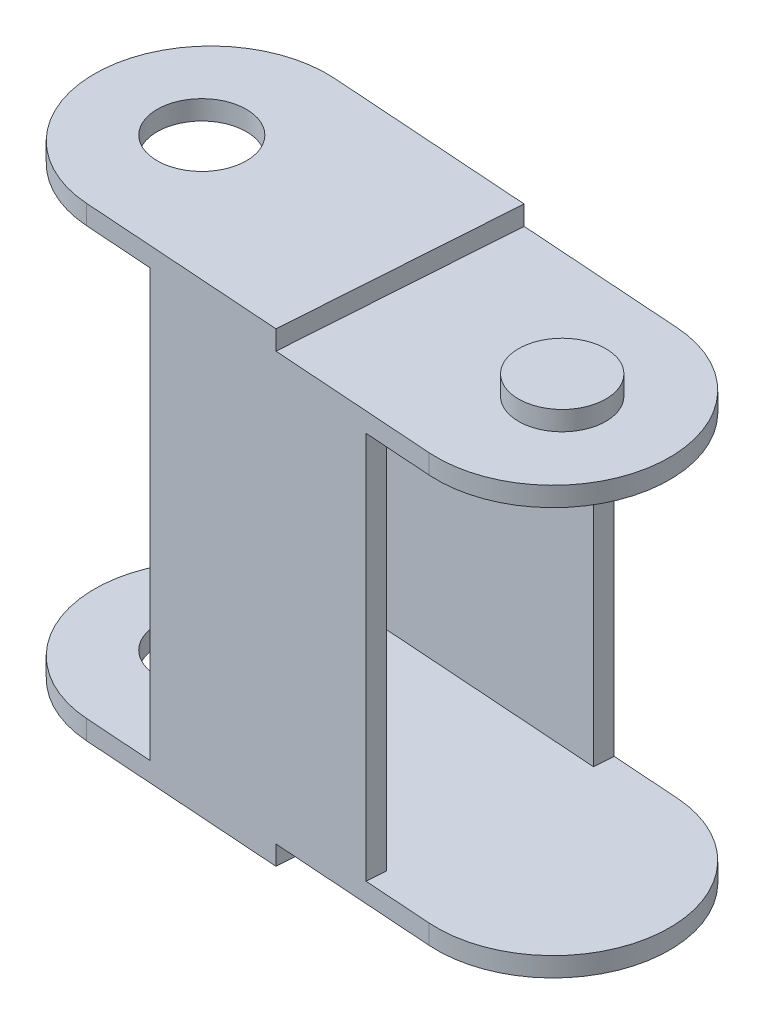
ISO-10303-21;
HEADER;
FILE_DESCRIPTION(('STEP AP214'),'2;1');
FILE_NAME('part.step','',(''),(''),'','','');
FILE_SCHEMA(('AUTOMOTIVE_DESIGN { 1 0 10303 214 1 1 1 1 }'));
ENDSEC;
DATA;
#1=APPLICATION_CONTEXT('core data for automotive mechanical design processes');
#2=APPLICATION_PROTOCOL_DEFINITION('international standard','automotive_design',2000,#1);
#3=PRODUCT_CONTEXT('',#1,'mechanical');
#4=PRODUCT('Part','Part','',(#3));
#5=PRODUCT_RELATED_PRODUCT_CATEGORY('part','',(#4));
#6=PRODUCT_DEFINITION_FORMATION('','',#4);
#7=PRODUCT_DEFINITION_CONTEXT('part definition',#1,'design');
#8=PRODUCT_DEFINITION('design','',#6,#7);
#9=PRODUCT_DEFINITION_SHAPE('','',#8);
#10=(LENGTH_UNIT() NAMED_UNIT(*) SI_UNIT(.MILLI.,.METRE.));
#11=(NAMED_UNIT(*) PLANE_ANGLE_UNIT() SI_UNIT($,.RADIAN.));
#12=(NAMED_UNIT(*) SI_UNIT($,.STERADIAN.) SOLID_ANGLE_UNIT());
#13=UNCERTAINTY_MEASURE_WITH_UNIT(LENGTH_MEASURE(1.E-05),#10,'distance_accuracy_value','');
#14=(GEOMETRIC_REPRESENTATION_CONTEXT(3) GLOBAL_UNCERTAINTY_ASSIGNED_CONTEXT((#13)) GLOBAL_UNIT_ASSIGNED_CONTEXT((#10,
#11,#12)) REPRESENTATION_CONTEXT('',''));
#15=CARTESIAN_POINT('',(0.,0.,0.));
#16=DIRECTION('',(0.,0.,1.));
#17=DIRECTION('',(1.,0.,0.));
#18=AXIS2_PLACEMENT_3D('',#15,#16,#17);
#19=CARTESIAN_POINT('',(-523.000001,21.5,76.));
#20=DIRECTION('',(0.,1.,0.));
#21=DIRECTION('',(0.997646356312232,0.,0.068569291500835));
#22=AXIS2_PLACEMENT_3D('',#19,#20,#21);
#23=CYLINDRICAL_SURFACE('',#22,2.25);
#24=CARTESIAN_POINT('',(-523.000001,21.,76.));
#25=DIRECTION('',(0.,1.,0.));
#26=DIRECTION('',(0.997646356312233,0.,0.068569291500832));
#27=AXIS2_PLACEMENT_3D('',#24,#25,#26);
#28=CIRCLE('',#27,2.25);
#29=CARTESIAN_POINT('',(-520.755296698297,21.,76.1542809058769));
#30=VERTEX_POINT('',#29);
#31=EDGE_CURVE('E205',#30,#30,#28,.F.);
#32=ORIENTED_EDGE('',*,*,#31,.F.);
#33=EDGE_LOOP('',(#32));
#34=FACE_BOUND('',#33,.T.);
#35=CARTESIAN_POINT('',(-523.000001,22.,76.));
#36=DIRECTION('',(0.,-1.,0.));
#37=DIRECTION('',(-0.997646356312233,0.,-0.068569291500832));
#38=AXIS2_PLACEMENT_3D('',#35,#36,#37);
#39=CIRCLE('',#38,2.25);
#40=CARTESIAN_POINT('',(-525.244705301703,22.,75.8457190941231));
#41=VERTEX_POINT('',#40);
#42=EDGE_CURVE('E202',#41,#41,#39,.F.);
#43=ORIENTED_EDGE('',*,*,#42,.F.);
#44=EDGE_LOOP('',(#43));
#45=FACE_BOUND('',#44,.T.);
#46=ADVANCED_FACE('F17',(#34,#45),#23,.T.);
#47=CARTESIAN_POINT('',(-531.567402457783,21.,69.396998238654));
#48=DIRECTION('',(0.,1.,0.));
#49=DIRECTION('',(-0.068569291500836,0.,0.997646356312232));
#50=AXIS2_PLACEMENT_3D('',#47,#48,#49);
#51=PLANE('',#50);
#52=CARTESIAN_POINT('',(-523.498824178263,21.,75.965715354343));
#53=DIRECTION('',(0.,1.,0.));
#54=DIRECTION('',(0.997646356313376,0.,0.0685692914842));
#55=AXIS2_PLACEMENT_3D('',#52,#53,#54);
#56=CIRCLE('',#55,6.);
#57=CARTESIAN_POINT('',(-523.087408429233,21.,69.979837216471));
#58=VERTEX_POINT('',#57);
#59=CARTESIAN_POINT('',(-523.910239927257,21.,81.951593492117));
#60=VERTEX_POINT('',#59);
#61=EDGE_CURVE('E189',#58,#60,#56,.F.);
#62=ORIENTED_EDGE('',*,*,#61,.F.);
#63=DIRECTION('',(-0.997646356311664,0.,-0.068569291509109));
#64=VECTOR('',#63,1.);
#65=CARTESIAN_POINT('',(-523.087408429233,21.,69.979837216474));
#66=LINE('',#65,#64);
#67=CARTESIAN_POINT('',(-531.567402457783,21.,69.396998238654));
#68=VERTEX_POINT('',#67);
#69=EDGE_CURVE('E177',#68,#58,#66,.F.);
#70=ORIENTED_EDGE('',*,*,#69,.F.);
#71=DIRECTION('',(-0.068569291500845,0.,0.997646356312232));
#72=VECTOR('',#71,1.);
#73=CARTESIAN_POINT('',(-531.567402457783,21.,69.396998238654));
#74=LINE('',#73,#72);
#75=CARTESIAN_POINT('',(-532.3902339558,21.,81.3687545145));
#76=VERTEX_POINT('',#75);
#77=EDGE_CURVE('E188',#76,#68,#74,.F.);
#78=ORIENTED_EDGE('',*,*,#77,.F.);
#79=DIRECTION('',(0.997646356313296,0.,0.068569291485357));
#80=VECTOR('',#79,1.);
#81=CARTESIAN_POINT('',(-532.3902339558,21.,81.3687545145));
#82=LINE('',#81,#80);
#83=EDGE_CURVE('E201',#60,#76,#82,.F.);
#84=ORIENTED_EDGE('',*,*,#83,.F.);
#85=EDGE_LOOP('',(#62,#70,#78,#84));
#86=FACE_BOUND('',#85,.T.);
#87=ORIENTED_EDGE('',*,*,#31,.T.);
#88=EDGE_LOOP('',(#87));
#89=FACE_BOUND('',#88,.T.);
#90=ADVANCED_FACE('F199',(#86,#89),#51,.T.);
#91=CARTESIAN_POINT('',(-525.403114108703,22.,78.150482139691));
#92=DIRECTION('',(0.,1.,0.));
#93=DIRECTION('',(0.997646356312232,0.,0.068569291500836));
#94=AXIS2_PLACEMENT_3D('',#91,#92,#93);
#95=PLANE('',#94);
#96=ORIENTED_EDGE('',*,*,#42,.T.);
#97=EDGE_LOOP('',(#96));
#98=FACE_BOUND('',#97,.T.);
#99=ADVANCED_FACE('F629',(#98),#95,.T.);
#100=CARTESIAN_POINT('',(-523.498824178249,-2.,75.965715354143));
#101=DIRECTION('',(0.,1.,0.));
#102=DIRECTION('',(-0.068569291500883,0.,0.997646356312229));
#103=AXIS2_PLACEMENT_3D('',#100,#101,#102);
#104=CYLINDRICAL_SURFACE('',#103,6.);
#105=DIRECTION('',(2.0577E-11,-1.,1.407E-12));
#106=VECTOR('',#105,1.);
#107=CARTESIAN_POINT('',(-523.91023992725,21.,81.951593492017));
#108=LINE('',#107,#106);
#109=CARTESIAN_POINT('',(-523.910239927229,20.,81.951593492018));
#110=VERTEX_POINT('',#109);
#111=EDGE_CURVE('E217',#110,#60,#108,.F.);
#112=ORIENTED_EDGE('',*,*,#111,.F.);
#113=CARTESIAN_POINT('',(-523.498824178249,20.,75.965715354143));
#114=DIRECTION('',(0.,1.,0.));
#115=DIRECTION('',(-0.068569291496696,0.,0.997646356312517));
#116=AXIS2_PLACEMENT_3D('',#113,#114,#115);
#117=CIRCLE('',#116,6.);
#118=CARTESIAN_POINT('',(-523.087408429249,20.,69.97983721647));
#119=VERTEX_POINT('',#118);
#120=EDGE_CURVE('E196',#110,#119,#117,.T.);
#121=ORIENTED_EDGE('',*,*,#120,.T.);
#122=DIRECTION('',(1.5916E-11,1.,1.094E-12));
#123=VECTOR('',#122,1.);
#124=CARTESIAN_POINT('',(-523.087408429249,20.,69.97983721647));
#125=LINE('',#124,#123);
#126=EDGE_CURVE('E181',#119,#58,#125,.T.);
#127=ORIENTED_EDGE('',*,*,#126,.T.);
#128=ORIENTED_EDGE('',*,*,#61,.T.);
#129=EDGE_LOOP('',(#112,#121,#127,#128));
#130=FACE_BOUND('',#129,.T.);
#131=ADVANCED_FACE('F195',(#130),#104,.T.);
#132=CARTESIAN_POINT('',(-523.087408429222,-2.,69.979837216371));
#133=DIRECTION('',(0.068569291500836,0.,-0.997646356312232));
#134=DIRECTION('',(-0.997646356312232,0.,-0.068569291500836));
#135=AXIS2_PLACEMENT_3D('',#132,#133,#134);
#136=PLANE('',#135);
#137=DIRECTION('',(0.,-1.,0.));
#138=VECTOR('',#137,1.);
#139=CARTESIAN_POINT('',(-531.567402457781,22.,69.396998238621));
#140=LINE('',#139,#138);
#141=CARTESIAN_POINT('',(-531.567402457781,22.,69.396998238621));
#142=VERTEX_POINT('',#141);
#143=EDGE_CURVE('E184',#142,#68,#140,.T.);
#144=ORIENTED_EDGE('',*,*,#143,.T.);
#145=ORIENTED_EDGE('',*,*,#69,.T.);
#146=ORIENTED_EDGE('',*,*,#126,.F.);
#147=DIRECTION('',(-0.997646356312232,0.,-0.068569291500836));
#148=VECTOR('',#147,1.);
#149=CARTESIAN_POINT('',(-523.087408429242,20.,69.97983721637));
#150=LINE('',#149,#148);
#151=CARTESIAN_POINT('',(-526.579170676188,20.,69.739844696127));
#152=VERTEX_POINT('',#151);
#153=EDGE_CURVE('E229',#119,#152,#150,.T.);
#154=ORIENTED_EDGE('',*,*,#153,.T.);
#155=DIRECTION('',(0.,-1.,0.));
#156=VECTOR('',#155,1.);
#157=CARTESIAN_POINT('',(-526.579170676188,20.,69.739844696127));
#158=LINE('',#157,#156);
#159=CARTESIAN_POINT('',(-526.579170676188,0.,69.739844696127));
#160=VERTEX_POINT('',#159);
#161=EDGE_CURVE('E233',#152,#160,#158,.T.);
#162=ORIENTED_EDGE('',*,*,#161,.T.);
#163=DIRECTION('',(0.997646356312232,0.,0.068569291500834));
#164=VECTOR('',#163,1.);
#165=CARTESIAN_POINT('',(-526.579170676188,0.,69.739844696127));
#166=LINE('',#165,#164);
#167=CARTESIAN_POINT('',(-523.087408429226,0.,69.979837216371));
#168=VERTEX_POINT('',#167);
#169=EDGE_CURVE('E238',#160,#168,#166,.T.);
#170=ORIENTED_EDGE('',*,*,#169,.T.);
#171=DIRECTION('',(4.32E-12,-1.,2.98E-13));
#172=VECTOR('',#171,1.);
#173=CARTESIAN_POINT('',(-523.087408429226,0.,69.979837216371));
#174=LINE('',#173,#172);
#175=CARTESIAN_POINT('',(-523.087408429222,-1.,69.979837216371));
#176=VERTEX_POINT('',#175);
#177=EDGE_CURVE('E243',#176,#168,#174,.F.);
#178=ORIENTED_EDGE('',*,*,#177,.F.);
#179=DIRECTION('',(-0.997646356312232,0.,-0.068569291500836));
#180=VECTOR('',#179,1.);
#181=CARTESIAN_POINT('',(-523.087408429222,-1.,69.979837216371));
#182=LINE('',#181,#180);
#183=CARTESIAN_POINT('',(-531.567402457781,-1.,69.396998238621));
#184=VERTEX_POINT('',#183);
#185=EDGE_CURVE('E247',#176,#184,#182,.T.);
#186=ORIENTED_EDGE('',*,*,#185,.T.);
#187=DIRECTION('',(0.,-1.,0.));
#188=VECTOR('',#187,1.);
#189=CARTESIAN_POINT('',(-531.567402457781,-1.,69.396998238621));
#190=LINE('',#189,#188);
#191=CARTESIAN_POINT('',(-531.567402457781,-2.,69.396998238621));
#192=VERTEX_POINT('',#191);
#193=EDGE_CURVE('E252',#184,#192,#190,.T.);
#194=ORIENTED_EDGE('',*,*,#193,.T.);
#195=DIRECTION('',(-0.997646356312232,0.,-0.068569291500835));
#196=VECTOR('',#195,1.);
#197=CARTESIAN_POINT('',(-531.567402457781,-2.,69.396998238621));
#198=LINE('',#197,#196);
#199=CARTESIAN_POINT('',(-542.042689199083,-2.,68.67702067786));
#200=VERTEX_POINT('',#199);
#201=EDGE_CURVE('E257',#192,#200,#198,.T.);
#202=ORIENTED_EDGE('',*,*,#201,.T.);
#203=DIRECTION('',(0.,1.,0.));
#204=VECTOR('',#203,1.);
#205=CARTESIAN_POINT('',(-542.042689199083,-2.,68.67702067786));
#206=LINE('',#205,#204);
#207=CARTESIAN_POINT('',(-542.042689199083,-1.,68.67702067786));
#208=VERTEX_POINT('',#207);
#209=EDGE_CURVE('E262',#200,#208,#206,.T.);
#210=ORIENTED_EDGE('',*,*,#209,.T.);
#211=DIRECTION('',(0.997646356312232,0.,0.068569291500835));
#212=VECTOR('',#211,1.);
#213=CARTESIAN_POINT('',(-542.042689199083,-1.,68.67702067786));
#214=LINE('',#213,#212);
#215=CARTESIAN_POINT('',(-538.550926951972,-1.,68.917013198115));
#216=VERTEX_POINT('',#215);
#217=EDGE_CURVE('E267',#208,#216,#214,.T.);
#218=ORIENTED_EDGE('',*,*,#217,.T.);
#219=DIRECTION('',(0.,1.,0.));
#220=VECTOR('',#219,1.);
#221=CARTESIAN_POINT('',(-538.550926951972,-1.,68.917013198115));
#222=LINE('',#221,#220);
#223=CARTESIAN_POINT('',(-538.550926951972,21.,68.917013198115));
#224=VERTEX_POINT('',#223);
#225=EDGE_CURVE('E272',#216,#224,#222,.T.);
#226=ORIENTED_EDGE('',*,*,#225,.T.);
#227=DIRECTION('',(-0.997646356312232,0.,-0.068569291500833));
#228=VECTOR('',#227,1.);
#229=CARTESIAN_POINT('',(-538.550926951972,21.,68.917013198115));
#230=LINE('',#229,#228);
#231=CARTESIAN_POINT('',(-542.042689199083,21.,68.67702067786));
#232=VERTEX_POINT('',#231);
#233=EDGE_CURVE('E277',#224,#232,#230,.T.);
#234=ORIENTED_EDGE('',*,*,#233,.T.);
#235=DIRECTION('',(0.,1.,0.));
#236=VECTOR('',#235,1.);
#237=CARTESIAN_POINT('',(-542.042689199083,21.,68.67702067786));
#238=LINE('',#237,#236);
#239=CARTESIAN_POINT('',(-542.042689199083,22.,68.67702067786));
#240=VERTEX_POINT('',#239);
#241=EDGE_CURVE('E282',#232,#240,#238,.T.);
#242=ORIENTED_EDGE('',*,*,#241,.T.);
#243=DIRECTION('',(0.997646356312232,0.,0.068569291500835));
#244=VECTOR('',#243,1.);
#245=CARTESIAN_POINT('',(-542.042689199083,22.,68.67702067786));
#246=LINE('',#245,#244);
#247=EDGE_CURVE('E287',#240,#142,#246,.T.);
#248=ORIENTED_EDGE('',*,*,#247,.T.);
#249=EDGE_LOOP('',(#144,#145,#146,#154,#162,#170,#178,#186,#194,#202,#210,#218,#226,#234,#242,#248));
#250=FACE_BOUND('',#249,.T.);
#251=ADVANCED_FACE('F179',(#250),#136,.T.);
#252=CARTESIAN_POINT('',(-532.3902339558,21.,81.3687545145));
#253=DIRECTION('',(0.997646356312232,0.,0.068569291500836));
#254=DIRECTION('',(0.068569291500836,0.,-0.997646356312232));
#255=AXIS2_PLACEMENT_3D('',#252,#253,#254);
#256=PLANE('',#255);
#257=DIRECTION('',(-0.068569291500834,0.,0.997646356312232));
#258=VECTOR('',#257,1.);
#259=CARTESIAN_POINT('',(-531.567402457785,22.,69.396998238674));
#260=LINE('',#259,#258);
#261=CARTESIAN_POINT('',(-532.390233955798,22.,81.368754514474));
#262=VERTEX_POINT('',#261);
#263=EDGE_CURVE('E291',#262,#142,#260,.F.);
#264=ORIENTED_EDGE('',*,*,#263,.F.);
#265=DIRECTION('',(-1.819E-12,-1.,2.5736E-11));
#266=VECTOR('',#265,1.);
#267=CARTESIAN_POINT('',(-532.390233955798,22.,81.368754514474));
#268=LINE('',#267,#266);
#269=EDGE_CURVE('E295',#76,#262,#268,.F.);
#270=ORIENTED_EDGE('',*,*,#269,.F.);
#271=ORIENTED_EDGE('',*,*,#77,.T.);
#272=ORIENTED_EDGE('',*,*,#143,.F.);
#273=EDGE_LOOP('',(#264,#270,#271,#272));
#274=FACE_BOUND('',#273,.T.);
#275=ADVANCED_FACE('F613',(#274),#256,.T.);
#276=CARTESIAN_POINT('',(-542.865520697094,-2.,80.648776953607));
#277=DIRECTION('',(-0.068569291500836,0.,0.997646356312232));
#278=DIRECTION('',(0.997646356312232,0.,0.068569291500836));
#279=AXIS2_PLACEMENT_3D('',#276,#277,#278);
#280=PLANE('',#279);
#281=ORIENTED_EDGE('',*,*,#83,.T.);
#282=ORIENTED_EDGE('',*,*,#269,.T.);
#283=DIRECTION('',(-0.997646356312232,0.,-0.068569291500835));
#284=VECTOR('',#283,1.);
#285=CARTESIAN_POINT('',(-532.390233955791,22.,81.368754514368));
#286=LINE('',#285,#284);
#287=CARTESIAN_POINT('',(-542.865520697094,22.,80.648776953607));
#288=VERTEX_POINT('',#287);
#289=EDGE_CURVE('E300',#262,#288,#286,.T.);
#290=ORIENTED_EDGE('',*,*,#289,.T.);
#291=DIRECTION('',(-1.14E-13,-1.,0.));
#292=VECTOR('',#291,1.);
#293=CARTESIAN_POINT('',(-542.865520697094,22.,80.648776953607));
#294=LINE('',#293,#292);
#295=CARTESIAN_POINT('',(-542.865520697094,21.,80.648776953607));
#296=VERTEX_POINT('',#295);
#297=EDGE_CURVE('E305',#296,#288,#294,.F.);
#298=ORIENTED_EDGE('',*,*,#297,.F.);
#299=DIRECTION('',(0.997646356312232,0.,0.068569291500838));
#300=VECTOR('',#299,1.);
#301=CARTESIAN_POINT('',(-542.865520697094,21.,80.648776953607));
#302=LINE('',#301,#300);
#303=CARTESIAN_POINT('',(-539.373758449982,21.,80.888769473861));
#304=VERTEX_POINT('',#303);
#305=EDGE_CURVE('E310',#296,#304,#302,.T.);
#306=ORIENTED_EDGE('',*,*,#305,.T.);
#307=DIRECTION('',(0.,-1.,0.));
#308=VECTOR('',#307,1.);
#309=CARTESIAN_POINT('',(-539.373758449982,21.,80.888769473861));
#310=LINE('',#309,#308);
#311=CARTESIAN_POINT('',(-539.373758449982,-1.,80.888769473861));
#312=VERTEX_POINT('',#311);
#313=EDGE_CURVE('E315',#304,#312,#310,.T.);
#314=ORIENTED_EDGE('',*,*,#313,.T.);
#315=DIRECTION('',(-0.997646356312232,0.,-0.068569291500834));
#316=VECTOR('',#315,1.);
#317=CARTESIAN_POINT('',(-539.373758449982,-1.,80.888769473861));
#318=LINE('',#317,#316);
#319=CARTESIAN_POINT('',(-542.865520697094,-1.,80.648776953607));
#320=VERTEX_POINT('',#319);
#321=EDGE_CURVE('E320',#312,#320,#318,.T.);
#322=ORIENTED_EDGE('',*,*,#321,.T.);
#323=DIRECTION('',(0.,-1.,0.));
#324=VECTOR('',#323,1.);
#325=CARTESIAN_POINT('',(-542.865520697094,-1.,80.648776953607));
#326=LINE('',#325,#324);
#327=CARTESIAN_POINT('',(-542.865520697094,-2.,80.648776953607));
#328=VERTEX_POINT('',#327);
#329=EDGE_CURVE('E325',#328,#320,#326,.F.);
#330=ORIENTED_EDGE('',*,*,#329,.F.);
#331=DIRECTION('',(0.997646356312232,0.,0.068569291500836));
#332=VECTOR('',#331,1.);
#333=CARTESIAN_POINT('',(-542.865520697094,-2.,80.648776953607));
#334=LINE('',#333,#332);
#335=CARTESIAN_POINT('',(-532.390233955791,-2.,81.368754514367));
#336=VERTEX_POINT('',#335);
#337=EDGE_CURVE('E330',#328,#336,#334,.T.);
#338=ORIENTED_EDGE('',*,*,#337,.T.);
#339=DIRECTION('',(1.14E-13,1.,0.));
#340=VECTOR('',#339,1.);
#341=CARTESIAN_POINT('',(-532.390233955791,-2.,81.368754514367));
#342=LINE('',#341,#340);
#343=CARTESIAN_POINT('',(-532.390233955791,-1.,81.368754514367));
#344=VERTEX_POINT('',#343);
#345=EDGE_CURVE('E335',#336,#344,#342,.T.);
#346=ORIENTED_EDGE('',*,*,#345,.T.);
#347=DIRECTION('',(0.997646356312232,0.,0.068569291500837));
#348=VECTOR('',#347,1.);
#349=CARTESIAN_POINT('',(-532.390233955791,-1.,81.368754514367));
#350=LINE('',#349,#348);
#351=CARTESIAN_POINT('',(-523.910239927257,-1.,81.951593492116));
#352=VERTEX_POINT('',#351);
#353=EDGE_CURVE('E340',#344,#352,#350,.T.);
#354=ORIENTED_EDGE('',*,*,#353,.T.);
#355=DIRECTION('',(4.661E-12,1.,3.13E-13));
#356=VECTOR('',#355,1.);
#357=CARTESIAN_POINT('',(-523.910239927257,-1.,81.951593492116));
#358=LINE('',#357,#356);
#359=CARTESIAN_POINT('',(-523.910239927252,0.,81.951593492117));
#360=VERTEX_POINT('',#359);
#361=EDGE_CURVE('E345',#352,#360,#358,.T.);
#362=ORIENTED_EDGE('',*,*,#361,.T.);
#363=DIRECTION('',(-0.997646356312232,0.,-0.068569291500836));
#364=VECTOR('',#363,1.);
#365=CARTESIAN_POINT('',(-523.910239927252,0.,81.951593492117));
#366=LINE('',#365,#364);
#367=CARTESIAN_POINT('',(-527.402002174198,0.,81.711600971874));
#368=VERTEX_POINT('',#367);
#369=EDGE_CURVE('E350',#360,#368,#366,.T.);
#370=ORIENTED_EDGE('',*,*,#369,.T.);
#371=DIRECTION('',(0.,1.,0.));
#372=VECTOR('',#371,1.);
#373=CARTESIAN_POINT('',(-527.402002174198,0.,81.711600971874));
#374=LINE('',#373,#372);
#375=CARTESIAN_POINT('',(-527.402002174198,20.,81.711600971874));
#376=VERTEX_POINT('',#375);
#377=EDGE_CURVE('E355',#368,#376,#374,.T.);
#378=ORIENTED_EDGE('',*,*,#377,.T.);
#379=DIRECTION('',(0.997646356312232,0.,0.068569291500834));
#380=VECTOR('',#379,1.);
#381=CARTESIAN_POINT('',(-527.402002174198,20.,81.711600971874));
#382=LINE('',#381,#380);
#383=EDGE_CURVE('E360',#376,#110,#382,.T.);
#384=ORIENTED_EDGE('',*,*,#383,.T.);
#385=ORIENTED_EDGE('',*,*,#111,.T.);
#386=EDGE_LOOP('',(#281,#282,#290,#298,#306,#314,#322,#330,#338,#346,#354,#362,#370,#378,#384,#385));
#387=FACE_BOUND('',#386,.T.);
#388=ADVANCED_FACE('F555',(#387),#280,.T.);
#389=CARTESIAN_POINT('',(-539.373758449983,20.,80.888769473868));
#390=DIRECTION('',(0.,-1.,0.));
#391=DIRECTION('',(0.068569291500836,0.,-0.997646356312232));
#392=AXIS2_PLACEMENT_3D('',#389,#390,#391);
#393=PLANE('',#392);
#394=CARTESIAN_POINT('',(-542.952928126245,20.,74.628614169983));
#395=DIRECTION('',(0.,1.,0.));
#396=DIRECTION('',(0.997646356312232,0.,0.068569291500841));
#397=AXIS2_PLACEMENT_3D('',#394,#395,#396);
#398=CIRCLE('',#397,6.2);
#399=CARTESIAN_POINT('',(-539.287161449229,20.,79.628829632309));
#400=VERTEX_POINT('',#399);
#401=CARTESIAN_POINT('',(-538.637523952725,20.,70.176953039667));
#402=VERTEX_POINT('',#401);
#403=EDGE_CURVE('E365',#400,#402,#398,.T.);
#404=ORIENTED_EDGE('',*,*,#403,.T.);
#405=DIRECTION('',(0.068569291501466,0.,-0.997646356312189));
#406=VECTOR('',#405,1.);
#407=CARTESIAN_POINT('',(-538.637523952725,20.,70.176953039667));
#408=LINE('',#407,#406);
#409=CARTESIAN_POINT('',(-538.619496243473,20.,69.914659554427));
#410=VERTEX_POINT('',#409);
#411=EDGE_CURVE('E370',#402,#410,#408,.T.);
#412=ORIENTED_EDGE('',*,*,#411,.T.);
#413=DIRECTION('',(0.997646356312233,0.,0.068569291500831));
#414=VECTOR('',#413,1.);
#415=CARTESIAN_POINT('',(-538.619496243473,20.,69.914659554427));
#416=LINE('',#415,#414);
#417=CARTESIAN_POINT('',(-526.647739967689,20.,70.737491052439));
#418=VERTEX_POINT('',#417);
#419=EDGE_CURVE('E375',#418,#410,#416,.F.);
#420=ORIENTED_EDGE('',*,*,#419,.F.);
#421=DIRECTION('',(0.06856929150068,0.,-0.997646356312243));
#422=VECTOR('',#421,1.);
#423=CARTESIAN_POINT('',(-526.647739967689,20.,70.737491052439));
#424=LINE('',#423,#422);
#425=EDGE_CURVE('E379',#152,#418,#424,.F.);
#426=ORIENTED_EDGE('',*,*,#425,.F.);
#427=ORIENTED_EDGE('',*,*,#153,.F.);
#428=ORIENTED_EDGE('',*,*,#120,.F.);
#429=ORIENTED_EDGE('',*,*,#383,.F.);
#430=DIRECTION('',(0.068569291500585,0.,-0.997646356312249));
#431=VECTOR('',#430,1.);
#432=CARTESIAN_POINT('',(-527.402002174199,20.,81.71160097188));
#433=LINE('',#432,#431);
#434=CARTESIAN_POINT('',(-527.333432882698,20.,80.713954615562));
#435=VERTEX_POINT('',#434);
#436=EDGE_CURVE('E384',#435,#376,#433,.F.);
#437=ORIENTED_EDGE('',*,*,#436,.F.);
#438=DIRECTION('',(-0.997646356312232,0.,-0.068569291500835));
#439=VECTOR('',#438,1.);
#440=CARTESIAN_POINT('',(-527.333432882698,20.,80.713954615562));
#441=LINE('',#440,#439);
#442=CARTESIAN_POINT('',(-539.305189158481,20.,79.891123117549));
#443=VERTEX_POINT('',#442);
#444=EDGE_CURVE('E388',#443,#435,#441,.F.);
#445=ORIENTED_EDGE('',*,*,#444,.F.);
#446=DIRECTION('',(0.068569291500197,0.,-0.997646356312276));
#447=VECTOR('',#446,1.);
#448=CARTESIAN_POINT('',(-539.305189158481,20.,79.891123117549));
#449=LINE('',#448,#447);
#450=EDGE_CURVE('E392',#443,#400,#449,.T.);
#451=ORIENTED_EDGE('',*,*,#450,.T.);
#452=EDGE_LOOP('',(#404,#412,#420,#426,#427,#428,#429,#437,#445,#451));
#453=FACE_BOUND('',#452,.T.);
#454=ADVANCED_FACE('F557',(#453),#393,.T.);
#455=CARTESIAN_POINT('',(-526.647739967689,20.,70.737491052439));
#456=DIRECTION('',(0.997646356312232,0.,0.068569291500836));
#457=DIRECTION('',(0.,-1.,0.));
#458=AXIS2_PLACEMENT_3D('',#455,#456,#457);
#459=PLANE('',#458);
#460=DIRECTION('',(0.,-1.,0.));
#461=VECTOR('',#460,1.);
#462=CARTESIAN_POINT('',(-526.647739967689,20.,70.737491052439));
#463=LINE('',#462,#461);
#464=CARTESIAN_POINT('',(-526.647739967689,0.,70.737491052439));
#465=VERTEX_POINT('',#464);
#466=EDGE_CURVE('E397',#465,#418,#463,.F.);
#467=ORIENTED_EDGE('',*,*,#466,.F.);
#468=DIRECTION('',(0.068569291500809,0.,-0.997646356312234));
#469=VECTOR('',#468,1.);
#470=CARTESIAN_POINT('',(-526.647739967689,0.,70.737491052439));
#471=LINE('',#470,#469);
#472=EDGE_CURVE('E401',#465,#160,#471,.T.);
#473=ORIENTED_EDGE('',*,*,#472,.T.);
#474=ORIENTED_EDGE('',*,*,#161,.F.);
#475=ORIENTED_EDGE('',*,*,#425,.T.);
#476=EDGE_LOOP('',(#467,#473,#474,#475));
#477=FACE_BOUND('',#476,.T.);
#478=ADVANCED_FACE('F563',(#477),#459,.T.);
#479=CARTESIAN_POINT('',(-539.373758449984,0.,80.888769473881));
#480=DIRECTION('',(0.,1.,0.));
#481=DIRECTION('',(0.997646356312232,0.,0.068569291500836));
#482=AXIS2_PLACEMENT_3D('',#479,#480,#481);
#483=PLANE('',#482);
#484=CARTESIAN_POINT('',(-542.952928126245,0.,74.628614169983));
#485=DIRECTION('',(0.,-1.,0.));
#486=DIRECTION('',(0.997646356312232,0.,0.06856929150084));
#487=AXIS2_PLACEMENT_3D('',#484,#485,#486);
#488=CIRCLE('',#487,6.2);
#489=CARTESIAN_POINT('',(-538.637523952725,0.,70.176953039667));
#490=VERTEX_POINT('',#489);
#491=CARTESIAN_POINT('',(-539.287161449229,0.,79.628829632309));
#492=VERTEX_POINT('',#491);
#493=EDGE_CURVE('E406',#490,#492,#488,.T.);
#494=ORIENTED_EDGE('',*,*,#493,.T.);
#495=DIRECTION('',(-0.068569291501918,0.,0.997646356312158));
#496=VECTOR('',#495,1.);
#497=CARTESIAN_POINT('',(-539.287161449229,0.,79.628829632309));
#498=LINE('',#497,#496);
#499=CARTESIAN_POINT('',(-539.305189158482,0.,79.891123117549));
#500=VERTEX_POINT('',#499);
#501=EDGE_CURVE('E411',#492,#500,#498,.T.);
#502=ORIENTED_EDGE('',*,*,#501,.T.);
#503=DIRECTION('',(0.997646356312232,0.,0.068569291500834));
#504=VECTOR('',#503,1.);
#505=CARTESIAN_POINT('',(-539.305189158482,0.,79.891123117549));
#506=LINE('',#505,#504);
#507=CARTESIAN_POINT('',(-527.333432882697,0.,80.713954615562));
#508=VERTEX_POINT('',#507);
#509=EDGE_CURVE('E416',#508,#500,#506,.F.);
#510=ORIENTED_EDGE('',*,*,#509,.F.);
#511=DIRECTION('',(-0.068569291501164,0.,0.99764635631221));
#512=VECTOR('',#511,1.);
#513=CARTESIAN_POINT('',(-527.333432882697,0.,80.713954615562));
#514=LINE('',#513,#512);
#515=EDGE_CURVE('E420',#368,#508,#514,.F.);
#516=ORIENTED_EDGE('',*,*,#515,.F.);
#517=ORIENTED_EDGE('',*,*,#369,.F.);
#518=CARTESIAN_POINT('',(-523.498824178263,0.,75.965715354343));
#519=DIRECTION('',(0.,1.,0.));
#520=DIRECTION('',(0.997646356313376,0.,0.068569291484202));
#521=AXIS2_PLACEMENT_3D('',#518,#519,#520);
#522=CIRCLE('',#521,6.);
#523=EDGE_CURVE('E425',#168,#360,#522,.F.);
#524=ORIENTED_EDGE('',*,*,#523,.F.);
#525=ORIENTED_EDGE('',*,*,#169,.F.);
#526=ORIENTED_EDGE('',*,*,#472,.F.);
#527=DIRECTION('',(-0.997646356312233,0.,-0.06856929150083));
#528=VECTOR('',#527,1.);
#529=CARTESIAN_POINT('',(-526.647739967689,0.,70.737491052439));
#530=LINE('',#529,#528);
#531=CARTESIAN_POINT('',(-538.619496243473,0.,69.914659554427));
#532=VERTEX_POINT('',#531);
#533=EDGE_CURVE('E429',#532,#465,#530,.F.);
#534=ORIENTED_EDGE('',*,*,#533,.F.);
#535=DIRECTION('',(-0.068569291499722,0.,0.997646356312309));
#536=VECTOR('',#535,1.);
#537=CARTESIAN_POINT('',(-538.619496243473,0.,69.914659554427));
#538=LINE('',#537,#536);
#539=EDGE_CURVE('E433',#532,#490,#538,.T.);
#540=ORIENTED_EDGE('',*,*,#539,.T.);
#541=EDGE_LOOP('',(#494,#502,#510,#516,#517,#524,#525,#526,#534,#540));
#542=FACE_BOUND('',#541,.T.);
#543=ADVANCED_FACE('F549',(#542),#483,.T.);
#544=CARTESIAN_POINT('',(-523.498824178263,-2.,75.965715354343));
#545=DIRECTION('',(0.,1.,0.));
#546=DIRECTION('',(0.997646356313376,0.,0.068569291484202));
#547=AXIS2_PLACEMENT_3D('',#544,#545,#546);
#548=CYLINDRICAL_SURFACE('',#547,6.);
#549=ORIENTED_EDGE('',*,*,#177,.T.);
#550=ORIENTED_EDGE('',*,*,#523,.T.);
#551=ORIENTED_EDGE('',*,*,#361,.F.);
#552=CARTESIAN_POINT('',(-523.498824178249,-1.,75.965715354143));
#553=DIRECTION('',(0.,-1.,0.));
#554=DIRECTION('',(0.99764635631109,0.,0.068569291517456));
#555=AXIS2_PLACEMENT_3D('',#552,#553,#554);
#556=CIRCLE('',#555,6.);
#557=EDGE_CURVE('E438',#352,#176,#556,.F.);
#558=ORIENTED_EDGE('',*,*,#557,.T.);
#559=EDGE_LOOP('',(#549,#550,#551,#558));
#560=FACE_BOUND('',#559,.T.);
#561=ADVANCED_FACE('F570',(#560),#548,.T.);
#562=CARTESIAN_POINT('',(-532.390233955793,-1.,81.368754514401));
#563=DIRECTION('',(0.,-1.,0.));
#564=DIRECTION('',(0.068569291500836,0.,-0.997646356312232));
#565=AXIS2_PLACEMENT_3D('',#562,#563,#564);
#566=PLANE('',#565);
#567=ORIENTED_EDGE('',*,*,#557,.F.);
#568=ORIENTED_EDGE('',*,*,#353,.F.);
#569=DIRECTION('',(0.068569291500836,0.,-0.997646356312232));
#570=VECTOR('',#569,1.);
#571=CARTESIAN_POINT('',(-532.390233955793,-1.,81.368754514401));
#572=LINE('',#571,#570);
#573=EDGE_CURVE('E443',#344,#184,#572,.T.);
#574=ORIENTED_EDGE('',*,*,#573,.T.);
#575=ORIENTED_EDGE('',*,*,#185,.F.);
#576=EDGE_LOOP('',(#567,#568,#574,#575));
#577=FACE_BOUND('',#576,.T.);
#578=CARTESIAN_POINT('',(-523.000001,-1.,76.));
#579=DIRECTION('',(0.,1.,0.));
#580=DIRECTION('',(0.997646356312233,0.,0.068569291500829));
#581=AXIS2_PLACEMENT_3D('',#578,#579,#580);
#582=CIRCLE('',#581,2.25);
#583=CARTESIAN_POINT('',(-520.755296698297,-1.,76.1542809058769));
#584=VERTEX_POINT('',#583);
#585=EDGE_CURVE('E448',#584,#584,#582,.T.);
#586=ORIENTED_EDGE('',*,*,#585,.T.);
#587=EDGE_LOOP('',(#586));
#588=FACE_BOUND('',#587,.T.);
#589=ADVANCED_FACE('F574',(#577,#588),#566,.T.);
#590=CARTESIAN_POINT('',(-532.390233955793,-2.,81.368754514401));
#591=DIRECTION('',(0.997646356312232,0.,0.068569291500836));
#592=DIRECTION('',(0.068569291500836,0.,-0.997646356312232));
#593=AXIS2_PLACEMENT_3D('',#590,#591,#592);
#594=PLANE('',#593);
#595=ORIENTED_EDGE('',*,*,#573,.F.);
#596=ORIENTED_EDGE('',*,*,#345,.F.);
#597=DIRECTION('',(0.068569291500834,0.,-0.997646356312232));
#598=VECTOR('',#597,1.);
#599=CARTESIAN_POINT('',(-532.390233955792,-2.,81.368754514388));
#600=LINE('',#599,#598);
#601=EDGE_CURVE('E453',#192,#336,#600,.F.);
#602=ORIENTED_EDGE('',*,*,#601,.F.);
#603=ORIENTED_EDGE('',*,*,#193,.F.);
#604=EDGE_LOOP('',(#595,#596,#602,#603));
#605=FACE_BOUND('',#604,.T.);
#606=ADVANCED_FACE('F578',(#605),#594,.T.);
#607=CARTESIAN_POINT('',(-548.851398834877,-2.,80.237361204741));
#608=DIRECTION('',(0.,-1.,0.));
#609=DIRECTION('',(0.068569291500836,0.,-0.997646356312232));
#610=AXIS2_PLACEMENT_3D('',#607,#608,#609);
#611=PLANE('',#610);
#612=ORIENTED_EDGE('',*,*,#601,.T.);
#613=ORIENTED_EDGE('',*,*,#337,.F.);
#614=CARTESIAN_POINT('',(-542.454104947996,-2.,74.66289881584));
#615=DIRECTION('',(0.,-1.,0.));
#616=DIRECTION('',(-0.997646356311089,0.,-0.068569291517474));
#617=AXIS2_PLACEMENT_3D('',#614,#615,#616);
#618=CIRCLE('',#617,6.);
#619=EDGE_CURVE('E455',#200,#328,#618,.F.);
#620=ORIENTED_EDGE('',*,*,#619,.F.);
#621=ORIENTED_EDGE('',*,*,#201,.F.);
#622=EDGE_LOOP('',(#612,#613,#620,#621));
#623=FACE_BOUND('',#622,.T.);
#624=CARTESIAN_POINT('',(-542.9529281263,-2.,74.6286141702));
#625=DIRECTION('',(0.,1.,0.));
#626=DIRECTION('',(0.997646356312232,0.,0.068569291500838));
#627=AXIS2_PLACEMENT_3D('',#624,#625,#626);
#628=CIRCLE('',#627,2.3);
#629=CARTESIAN_POINT('',(-540.658341506782,-2.,74.7863235406519));
#630=VERTEX_POINT('',#629);
#631=EDGE_CURVE('E459',#630,#630,#628,.T.);
#632=ORIENTED_EDGE('',*,*,#631,.T.);
#633=EDGE_LOOP('',(#632));
#634=FACE_BOUND('',#633,.T.);
#635=ADVANCED_FACE('F581',(#623,#634),#611,.T.);
#636=CARTESIAN_POINT('',(-542.454104947996,-2.,74.66289881584));
#637=DIRECTION('',(0.,1.,0.));
#638=DIRECTION('',(0.06856929148436,0.,-0.997646356313365));
#639=AXIS2_PLACEMENT_3D('',#636,#637,#638);
#640=CYLINDRICAL_SURFACE('',#639,6.);
#641=ORIENTED_EDGE('',*,*,#209,.F.);
#642=ORIENTED_EDGE('',*,*,#619,.T.);
#643=ORIENTED_EDGE('',*,*,#329,.T.);
#644=CARTESIAN_POINT('',(-542.454104947982,-1.,74.662898815641));
#645=DIRECTION('',(0.,1.,0.));
#646=DIRECTION('',(-0.997646356313374,0.,-0.06856929148422));
#647=AXIS2_PLACEMENT_3D('',#644,#645,#646);
#648=CIRCLE('',#647,6.);
#649=EDGE_CURVE('E464',#320,#208,#648,.F.);
#650=ORIENTED_EDGE('',*,*,#649,.T.);
#651=EDGE_LOOP('',(#641,#642,#643,#650));
#652=FACE_BOUND('',#651,.T.);
#653=ADVANCED_FACE('F587',(#652),#640,.T.);
#654=CARTESIAN_POINT('',(-548.851398834877,-1.,80.23736120475));
#655=DIRECTION('',(0.,1.,0.));
#656=DIRECTION('',(0.997646356312232,0.,0.068569291500836));
#657=AXIS2_PLACEMENT_3D('',#654,#655,#656);
#658=PLANE('',#657);
#659=ORIENTED_EDGE('',*,*,#217,.F.);
#660=ORIENTED_EDGE('',*,*,#649,.F.);
#661=ORIENTED_EDGE('',*,*,#321,.F.);
#662=DIRECTION('',(0.06856929150083,0.,-0.997646356312233));
#663=VECTOR('',#662,1.);
#664=CARTESIAN_POINT('',(-539.373758449992,-1.,80.888769474002));
#665=LINE('',#664,#663);
#666=CARTESIAN_POINT('',(-539.287161449229,-1.,79.628829632309));
#667=VERTEX_POINT('',#666);
#668=EDGE_CURVE('E467',#667,#312,#665,.F.);
#669=ORIENTED_EDGE('',*,*,#668,.F.);
#670=CARTESIAN_POINT('',(-542.952928126245,-1.,74.628614169983));
#671=DIRECTION('',(0.,1.,0.));
#672=DIRECTION('',(0.997646356312232,0.,0.068569291500843));
#673=AXIS2_PLACEMENT_3D('',#670,#671,#672);
#674=CIRCLE('',#673,6.2);
#675=CARTESIAN_POINT('',(-538.637523952725,-1.,70.176953039667));
#676=VERTEX_POINT('',#675);
#677=EDGE_CURVE('E471',#676,#667,#674,.F.);
#678=ORIENTED_EDGE('',*,*,#677,.F.);
#679=DIRECTION('',(0.068569291500916,0.,-0.997646356312227));
#680=VECTOR('',#679,1.);
#681=CARTESIAN_POINT('',(-538.637523952725,-1.,70.176953039667));
#682=LINE('',#681,#680);
#683=EDGE_CURVE('E475',#216,#676,#682,.F.);
#684=ORIENTED_EDGE('',*,*,#683,.F.);
#685=EDGE_LOOP('',(#659,#660,#661,#669,#678,#684));
#686=FACE_BOUND('',#685,.T.);
#687=CARTESIAN_POINT('',(-542.9529281263,-1.,74.6286141702));
#688=DIRECTION('',(0.,-1.,0.));
#689=DIRECTION('',(-0.997646356312233,0.,-0.068569291500826));
#690=AXIS2_PLACEMENT_3D('',#687,#688,#689);
#691=CIRCLE('',#690,2.3);
#692=CARTESIAN_POINT('',(-545.247514745818,-1.,74.4709047997481));
#693=VERTEX_POINT('',#692);
#694=EDGE_CURVE('E480',#693,#693,#691,.T.);
#695=ORIENTED_EDGE('',*,*,#694,.T.);
#696=EDGE_LOOP('',(#695));
#697=FACE_BOUND('',#696,.T.);
#698=ADVANCED_FACE('F590',(#686,#697),#658,.T.);
#699=CARTESIAN_POINT('',(-538.637523952725,-1.,70.176953039667));
#700=DIRECTION('',(-0.997646356312232,0.,-0.068569291500836));
#701=DIRECTION('',(0.,1.,0.));
#702=AXIS2_PLACEMENT_3D('',#699,#700,#701);
#703=PLANE('',#702);
#704=DIRECTION('',(0.,1.,0.));
#705=VECTOR('',#704,1.);
#706=CARTESIAN_POINT('',(-538.637523952725,20.,70.176953039667));
#707=LINE('',#706,#705);
#708=CARTESIAN_POINT('',(-538.637523952725,21.,70.176953039667));
#709=VERTEX_POINT('',#708);
#710=EDGE_CURVE('E485',#402,#709,#707,.T.);
#711=ORIENTED_EDGE('',*,*,#710,.T.);
#712=DIRECTION('',(0.068569291500851,0.,-0.997646356312231));
#713=VECTOR('',#712,1.);
#714=CARTESIAN_POINT('',(-538.637523952725,21.,70.176953039667));
#715=LINE('',#714,#713);
#716=EDGE_CURVE('E487',#709,#224,#715,.T.);
#717=ORIENTED_EDGE('',*,*,#716,.T.);
#718=ORIENTED_EDGE('',*,*,#225,.F.);
#719=ORIENTED_EDGE('',*,*,#683,.T.);
#720=DIRECTION('',(0.,1.,0.));
#721=VECTOR('',#720,1.);
#722=CARTESIAN_POINT('',(-538.637523952725,-1.,70.176953039667));
#723=LINE('',#722,#721);
#724=EDGE_CURVE('E492',#676,#490,#723,.T.);
#725=ORIENTED_EDGE('',*,*,#724,.T.);
#726=ORIENTED_EDGE('',*,*,#539,.F.);
#727=DIRECTION('',(0.,1.,0.));
#728=VECTOR('',#727,1.);
#729=CARTESIAN_POINT('',(-538.619496243473,0.,69.914659554427));
#730=LINE('',#729,#728);
#731=EDGE_CURVE('E497',#410,#532,#730,.F.);
#732=ORIENTED_EDGE('',*,*,#731,.F.);
#733=ORIENTED_EDGE('',*,*,#411,.F.);
#734=EDGE_LOOP('',(#711,#717,#718,#719,#725,#726,#732,#733));
#735=FACE_BOUND('',#734,.T.);
#736=ADVANCED_FACE('F595',(#735),#703,.T.);
#737=CARTESIAN_POINT('',(-548.851398834897,21.,80.237361205032));
#738=DIRECTION('',(0.,-1.,0.));
#739=DIRECTION('',(0.068569291500836,0.,-0.997646356312232));
#740=AXIS2_PLACEMENT_3D('',#737,#738,#739);
#741=PLANE('',#740);
#742=ORIENTED_EDGE('',*,*,#305,.F.);
#743=CARTESIAN_POINT('',(-542.454104947996,21.,74.66289881584));
#744=DIRECTION('',(0.,-1.,0.));
#745=DIRECTION('',(-0.997646356311089,0.,-0.068569291517471));
#746=AXIS2_PLACEMENT_3D('',#743,#744,#745);
#747=CIRCLE('',#746,6.);
#748=EDGE_CURVE('E501',#232,#296,#747,.F.);
#749=ORIENTED_EDGE('',*,*,#748,.F.);
#750=ORIENTED_EDGE('',*,*,#233,.F.);
#751=ORIENTED_EDGE('',*,*,#716,.F.);
#752=CARTESIAN_POINT('',(-542.952928126245,21.,74.628614169983));
#753=DIRECTION('',(0.,-1.,0.));
#754=DIRECTION('',(0.997646356312232,0.,0.068569291500842));
#755=AXIS2_PLACEMENT_3D('',#752,#753,#754);
#756=CIRCLE('',#755,6.2);
#757=CARTESIAN_POINT('',(-539.287161449229,21.,79.628829632309));
#758=VERTEX_POINT('',#757);
#759=EDGE_CURVE('E36',#758,#709,#756,.F.);
#760=ORIENTED_EDGE('',*,*,#759,.F.);
#761=DIRECTION('',(-0.068569291500949,0.,0.997646356312225));
#762=VECTOR('',#761,1.);
#763=CARTESIAN_POINT('',(-539.287161449229,21.,79.628829632309));
#764=LINE('',#763,#762);
#765=EDGE_CURVE('E508',#304,#758,#764,.F.);
#766=ORIENTED_EDGE('',*,*,#765,.F.);
#767=EDGE_LOOP('',(#742,#749,#750,#751,#760,#766));
#768=FACE_BOUND('',#767,.T.);
#769=CARTESIAN_POINT('',(-542.9529281263,21.,74.6286141702));
#770=DIRECTION('',(0.,1.,0.));
#771=DIRECTION('',(-0.997646356312233,0.,-0.068569291500826));
#772=AXIS2_PLACEMENT_3D('',#769,#770,#771);
#773=CIRCLE('',#772,2.3);
#774=CARTESIAN_POINT('',(-545.247514745818,21.,74.4709047997481));
#775=VERTEX_POINT('',#774);
#776=EDGE_CURVE('E513',#775,#775,#773,.T.);
#777=ORIENTED_EDGE('',*,*,#776,.T.);
#778=EDGE_LOOP('',(#777));
#779=FACE_BOUND('',#778,.T.);
#780=ADVANCED_FACE('F600',(#768,#779),#741,.T.);
#781=CARTESIAN_POINT('',(-542.454104947996,-2.,74.66289881584));
#782=DIRECTION('',(0.,1.,0.));
#783=DIRECTION('',(0.068569291484362,0.,-0.997646356313365));
#784=AXIS2_PLACEMENT_3D('',#781,#782,#783);
#785=CYLINDRICAL_SURFACE('',#784,6.);
#786=ORIENTED_EDGE('',*,*,#748,.T.);
#787=ORIENTED_EDGE('',*,*,#297,.T.);
#788=CARTESIAN_POINT('',(-542.454104947982,22.,74.662898815641));
#789=DIRECTION('',(0.,1.,0.));
#790=DIRECTION('',(-0.997646356313374,0.,-0.068569291484222));
#791=AXIS2_PLACEMENT_3D('',#788,#789,#790);
#792=CIRCLE('',#791,6.);
#793=EDGE_CURVE('E518',#288,#240,#792,.F.);
#794=ORIENTED_EDGE('',*,*,#793,.T.);
#795=ORIENTED_EDGE('',*,*,#241,.F.);
#796=EDGE_LOOP('',(#786,#787,#794,#795));
#797=FACE_BOUND('',#796,.T.);
#798=ADVANCED_FACE('F605',(#797),#785,.T.);
#799=CARTESIAN_POINT('',(-548.851398834877,22.,80.237361204741));
#800=DIRECTION('',(0.,1.,0.));
#801=DIRECTION('',(0.997646356312232,0.,0.068569291500836));
#802=AXIS2_PLACEMENT_3D('',#799,#800,#801);
#803=PLANE('',#802);
#804=ORIENTED_EDGE('',*,*,#263,.T.);
#805=ORIENTED_EDGE('',*,*,#247,.F.);
#806=ORIENTED_EDGE('',*,*,#793,.F.);
#807=ORIENTED_EDGE('',*,*,#289,.F.);
#808=EDGE_LOOP('',(#804,#805,#806,#807));
#809=FACE_BOUND('',#808,.T.);
#810=CARTESIAN_POINT('',(-542.9529281263,22.,74.6286141702));
#811=DIRECTION('',(0.,-1.,0.));
#812=DIRECTION('',(0.997646356312232,0.,0.068569291500838));
#813=AXIS2_PLACEMENT_3D('',#810,#811,#812);
#814=CIRCLE('',#813,2.3);
#815=CARTESIAN_POINT('',(-540.658341506782,22.,74.7863235406519));
#816=VERTEX_POINT('',#815);
#817=EDGE_CURVE('E521',#816,#816,#814,.T.);
#818=ORIENTED_EDGE('',*,*,#817,.T.);
#819=EDGE_LOOP('',(#818));
#820=FACE_BOUND('',#819,.T.);
#821=ADVANCED_FACE('F608',(#809,#820),#803,.T.);
#822=CARTESIAN_POINT('',(-539.373758450011,-1.,80.888769474285));
#823=DIRECTION('',(-0.997646356312232,0.,-0.068569291500836));
#824=DIRECTION('',(0.,1.,0.));
#825=AXIS2_PLACEMENT_3D('',#822,#823,#824);
#826=PLANE('',#825);
#827=DIRECTION('',(0.,-1.,0.));
#828=VECTOR('',#827,1.);
#829=CARTESIAN_POINT('',(-539.287161449229,21.,79.628829632309));
#830=LINE('',#829,#828);
#831=EDGE_CURVE('E32',#758,#400,#830,.T.);
#832=ORIENTED_EDGE('',*,*,#831,.T.);
#833=ORIENTED_EDGE('',*,*,#450,.F.);
#834=DIRECTION('',(0.,-1.,0.));
#835=VECTOR('',#834,1.);
#836=CARTESIAN_POINT('',(-539.305189158481,20.,79.891123117549));
#837=LINE('',#836,#835);
#838=EDGE_CURVE('E527',#500,#443,#837,.F.);
#839=ORIENTED_EDGE('',*,*,#838,.F.);
#840=ORIENTED_EDGE('',*,*,#501,.F.);
#841=DIRECTION('',(0.,-1.,0.));
#842=VECTOR('',#841,1.);
#843=CARTESIAN_POINT('',(-539.287161449229,0.,79.628829632309));
#844=LINE('',#843,#842);
#845=EDGE_CURVE('E531',#492,#667,#844,.T.);
#846=ORIENTED_EDGE('',*,*,#845,.T.);
#847=ORIENTED_EDGE('',*,*,#668,.T.);
#848=ORIENTED_EDGE('',*,*,#313,.F.);
#849=ORIENTED_EDGE('',*,*,#765,.T.);
#850=EDGE_LOOP('',(#832,#833,#839,#840,#846,#847,#848,#849));
#851=FACE_BOUND('',#850,.T.);
#852=ADVANCED_FACE('F781',(#851),#826,.T.);
#853=CARTESIAN_POINT('',(-527.4020021742,20.,81.7116009719));
#854=DIRECTION('',(0.997646356312232,0.,0.068569291500836));
#855=DIRECTION('',(0.,-1.,0.));
#856=AXIS2_PLACEMENT_3D('',#853,#854,#855);
#857=PLANE('',#856);
#858=DIRECTION('',(0.,1.,0.));
#859=VECTOR('',#858,1.);
#860=CARTESIAN_POINT('',(-527.333432882698,0.,80.713954615562));
#861=LINE('',#860,#859);
#862=EDGE_CURVE('E25',#435,#508,#861,.F.);
#863=ORIENTED_EDGE('',*,*,#862,.F.);
#864=ORIENTED_EDGE('',*,*,#436,.T.);
#865=ORIENTED_EDGE('',*,*,#377,.F.);
#866=ORIENTED_EDGE('',*,*,#515,.T.);
#867=EDGE_LOOP('',(#863,#864,#865,#866));
#868=FACE_BOUND('',#867,.T.);
#869=ADVANCED_FACE('F552',(#868),#857,.T.);
#870=CARTESIAN_POINT('',(-542.952928126245,20.5,74.628614169983));
#871=DIRECTION('',(0.,1.,0.));
#872=DIRECTION('',(0.591252689841275,0.,0.806486364891222));
#873=AXIS2_PLACEMENT_3D('',#870,#871,#872);
#874=CYLINDRICAL_SURFACE('',#873,6.2);
#875=ORIENTED_EDGE('',*,*,#831,.F.);
#876=ORIENTED_EDGE('',*,*,#759,.T.);
#877=ORIENTED_EDGE('',*,*,#710,.F.);
#878=ORIENTED_EDGE('',*,*,#403,.F.);
#879=EDGE_LOOP('',(#875,#876,#877,#878));
#880=FACE_BOUND('',#879,.T.);
#881=ADVANCED_FACE('F801',(#880),#874,.F.);
#882=CARTESIAN_POINT('',(-538.619496243473,20.,69.914659554427));
#883=DIRECTION('',(-0.068569291500836,0.,0.997646356312232));
#884=DIRECTION('',(0.,-1.,0.));
#885=AXIS2_PLACEMENT_3D('',#882,#883,#884);
#886=PLANE('',#885);
#887=ORIENTED_EDGE('',*,*,#731,.T.);
#888=ORIENTED_EDGE('',*,*,#533,.T.);
#889=ORIENTED_EDGE('',*,*,#466,.T.);
#890=ORIENTED_EDGE('',*,*,#419,.T.);
#891=EDGE_LOOP('',(#887,#888,#889,#890));
#892=FACE_BOUND('',#891,.T.);
#893=ADVANCED_FACE('F811',(#892),#886,.T.);
#894=CARTESIAN_POINT('',(-539.305189158481,0.,79.891123117549));
#895=DIRECTION('',(0.068569291500836,0.,-0.997646356312232));
#896=DIRECTION('',(0.,1.,0.));
#897=AXIS2_PLACEMENT_3D('',#894,#895,#896);
#898=PLANE('',#897);
#899=ORIENTED_EDGE('',*,*,#838,.T.);
#900=ORIENTED_EDGE('',*,*,#444,.T.);
#901=ORIENTED_EDGE('',*,*,#862,.T.);
#902=ORIENTED_EDGE('',*,*,#509,.T.);
#903=EDGE_LOOP('',(#899,#900,#901,#902));
#904=FACE_BOUND('',#903,.T.);
#905=ADVANCED_FACE('F542',(#904),#898,.T.);
#906=CARTESIAN_POINT('',(-542.952928126245,-0.5,74.628614169983));
#907=DIRECTION('',(0.,1.,0.));
#908=DIRECTION('',(0.997646356312232,0.,0.068569291500841));
#909=AXIS2_PLACEMENT_3D('',#906,#907,#908);
#910=CYLINDRICAL_SURFACE('',#909,6.2);
#911=ORIENTED_EDGE('',*,*,#724,.F.);
#912=ORIENTED_EDGE('',*,*,#677,.T.);
#913=ORIENTED_EDGE('',*,*,#845,.F.);
#914=ORIENTED_EDGE('',*,*,#493,.F.);
#915=EDGE_LOOP('',(#911,#912,#913,#914));
#916=FACE_BOUND('',#915,.T.);
#917=ADVANCED_FACE('F831',(#916),#910,.F.);
#918=CARTESIAN_POINT('',(-523.000001,-1.5,76.));
#919=DIRECTION('',(0.,1.,0.));
#920=DIRECTION('',(0.997646356312232,0.,0.068569291500835));
#921=AXIS2_PLACEMENT_3D('',#918,#919,#920);
#922=CYLINDRICAL_SURFACE('',#921,2.25);
#923=CARTESIAN_POINT('',(-523.000001,-2.,76.));
#924=DIRECTION('',(0.,1.,0.));
#925=DIRECTION('',(0.997646356312233,0.,0.068569291500832));
#926=AXIS2_PLACEMENT_3D('',#923,#924,#925);
#927=CIRCLE('',#926,2.25);
#928=CARTESIAN_POINT('',(-520.755296698297,-2.,76.1542809058769));
#929=VERTEX_POINT('',#928);
#930=EDGE_CURVE('E11',#929,#929,#927,.F.);
#931=ORIENTED_EDGE('',*,*,#930,.F.);
#932=EDGE_LOOP('',(#931));
#933=FACE_BOUND('',#932,.T.);
#934=ORIENTED_EDGE('',*,*,#585,.F.);
#935=EDGE_LOOP('',(#934));
#936=FACE_BOUND('',#935,.T.);
#937=ADVANCED_FACE('F841',(#933,#936),#922,.T.);
#938=CARTESIAN_POINT('',(-542.9529281263,10.,74.6286141702));
#939=DIRECTION('',(0.,1.,0.));
#940=DIRECTION('',(0.997646356312232,0.,0.068569291500838));
#941=AXIS2_PLACEMENT_3D('',#938,#939,#940);
#942=CYLINDRICAL_SURFACE('',#941,2.3);
#943=ORIENTED_EDGE('',*,*,#694,.F.);
#944=EDGE_LOOP('',(#943));
#945=FACE_BOUND('',#944,.T.);
#946=ORIENTED_EDGE('',*,*,#631,.F.);
#947=EDGE_LOOP('',(#946));
#948=FACE_BOUND('',#947,.T.);
#949=ADVANCED_FACE('F852',(#945,#948),#942,.F.);
#950=CARTESIAN_POINT('',(-542.9529281263,10.,74.6286141702));
#951=DIRECTION('',(0.,1.,0.));
#952=DIRECTION('',(-0.997646356312233,0.,-0.068569291500832));
#953=AXIS2_PLACEMENT_3D('',#950,#951,#952);
#954=CYLINDRICAL_SURFACE('',#953,2.3);
#955=ORIENTED_EDGE('',*,*,#776,.F.);
#956=EDGE_LOOP('',(#955));
#957=FACE_BOUND('',#956,.T.);
#958=ORIENTED_EDGE('',*,*,#817,.F.);
#959=EDGE_LOOP('',(#958));
#960=FACE_BOUND('',#959,.T.);
#961=ADVANCED_FACE('F863',(#957,#960),#954,.F.);
#962=CARTESIAN_POINT('',(-520.913705505298,-2.,78.459043951445));
#963=DIRECTION('',(0.,-1.,0.));
#964=DIRECTION('',(-0.997646356312232,0.,-0.068569291500836));
#965=AXIS2_PLACEMENT_3D('',#962,#963,#964);
#966=PLANE('',#965);
#967=ORIENTED_EDGE('',*,*,#930,.T.);
#968=EDGE_LOOP('',(#967));
#969=FACE_BOUND('',#968,.T.);
#970=ADVANCED_FACE('F19',(#969),#966,.T.);
#971=CLOSED_SHELL('',(#46,#90,#99,#131,#251,#275,#388,#454,#478,#543,#561,#589,#606,#635,#653,
#698,#736,#780,#798,#821,#852,#869,#881,#893,#905,#917,#937,#949,#961,#970));
#972=MANIFOLD_SOLID_BREP('B1',#971);
#973=ADVANCED_BREP_SHAPE_REPRESENTATION('',(#18,#972),#14);
#974=SHAPE_DEFINITION_REPRESENTATION(#9,#973);
ENDSEC;
END-ISO-10303-21;
